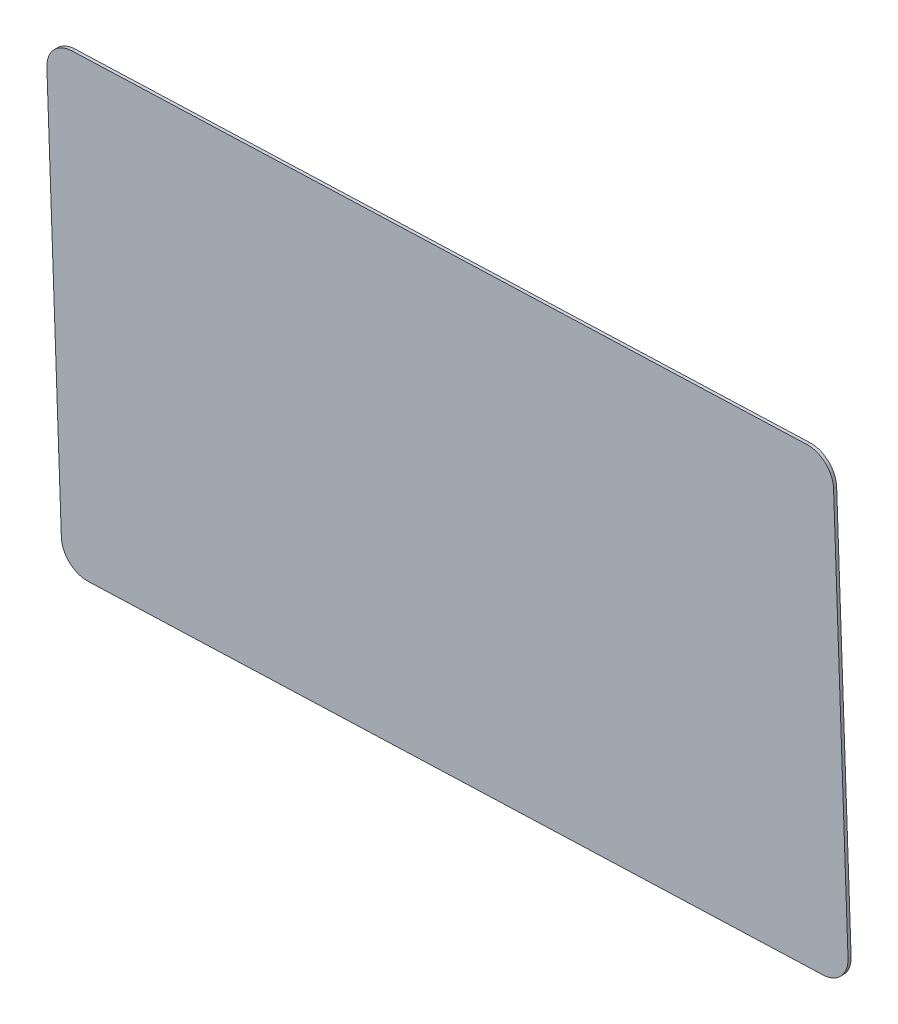
ISO-10303-21;
HEADER;
FILE_DESCRIPTION(('STEP AP214'),'2;1');
FILE_NAME('part.step','',(''),(''),'','','');
FILE_SCHEMA(('AUTOMOTIVE_DESIGN { 1 0 10303 214 1 1 1 1 }'));
ENDSEC;
DATA;
#1=APPLICATION_CONTEXT('core data for automotive mechanical design processes');
#2=APPLICATION_PROTOCOL_DEFINITION('international standard','automotive_design',2000,#1);
#3=PRODUCT_CONTEXT('',#1,'mechanical');
#4=PRODUCT('Part','Part','',(#3));
#5=PRODUCT_RELATED_PRODUCT_CATEGORY('part','',(#4));
#6=PRODUCT_DEFINITION_FORMATION('','',#4);
#7=PRODUCT_DEFINITION_CONTEXT('part definition',#1,'design');
#8=PRODUCT_DEFINITION('design','',#6,#7);
#9=PRODUCT_DEFINITION_SHAPE('','',#8);
#10=(LENGTH_UNIT() NAMED_UNIT(*) SI_UNIT(.MILLI.,.METRE.));
#11=(NAMED_UNIT(*) PLANE_ANGLE_UNIT() SI_UNIT($,.RADIAN.));
#12=(NAMED_UNIT(*) SI_UNIT($,.STERADIAN.) SOLID_ANGLE_UNIT());
#13=UNCERTAINTY_MEASURE_WITH_UNIT(LENGTH_MEASURE(1.E-05),#10,'distance_accuracy_value','');
#14=(GEOMETRIC_REPRESENTATION_CONTEXT(3) GLOBAL_UNCERTAINTY_ASSIGNED_CONTEXT((#13)) GLOBAL_UNIT_ASSIGNED_CONTEXT((#10,
#11,#12)) REPRESENTATION_CONTEXT('',''));
#15=CARTESIAN_POINT('',(0.,0.,0.));
#16=DIRECTION('',(0.,0.,1.));
#17=DIRECTION('',(1.,0.,0.));
#18=AXIS2_PLACEMENT_3D('',#15,#16,#17);
#19=CARTESIAN_POINT('',(141.751264719315,22.2891309095536,-0.762000000000022));
#20=DIRECTION('',(0.,0.,1.));
#21=DIRECTION('',(1.,0.,0.));
#22=AXIS2_PLACEMENT_3D('',#19,#20,#21);
#23=CYLINDRICAL_SURFACE('',#22,6.35);
#24=CARTESIAN_POINT('',(141.751264719315,22.2891309095536,0.));
#25=DIRECTION('',(0.,0.,-1.));
#26=DIRECTION('',(-1.,0.,0.));
#27=AXIS2_PLACEMENT_3D('',#24,#25,#26);
#28=CIRCLE('',#27,6.35);
#29=CARTESIAN_POINT('',(148.097112344466,22.5187347387161,0.));
#30=VERTEX_POINT('',#29);
#31=CARTESIAN_POINT('',(141.980868548478,15.9432832844026,0.));
#32=VERTEX_POINT('',#31);
#33=EDGE_CURVE('E129',#30,#32,#28,.T.);
#34=ORIENTED_EDGE('',*,*,#33,.T.);
#35=DIRECTION('',(0.,0.,1.));
#36=VECTOR('',#35,1.);
#37=CARTESIAN_POINT('',(141.980868548478,15.9432832844026,-0.762000000000023));
#38=LINE('',#37,#36);
#39=CARTESIAN_POINT('',(141.980868548478,15.9432832844026,-0.762000000000023));
#40=VERTEX_POINT('',#39);
#41=EDGE_CURVE('E11',#40,#32,#38,.T.);
#42=ORIENTED_EDGE('',*,*,#41,.F.);
#43=CARTESIAN_POINT('',(141.751264719315,22.2891309095536,-0.762000000000022));
#44=DIRECTION('',(0.,0.,-1.));
#45=DIRECTION('',(-1.,0.,0.));
#46=AXIS2_PLACEMENT_3D('',#43,#44,#45);
#47=CIRCLE('',#46,6.35);
#48=CARTESIAN_POINT('',(148.097112344466,22.5187347387161,-0.762000000000022));
#49=VERTEX_POINT('',#48);
#50=EDGE_CURVE('E143',#49,#40,#47,.T.);
#51=ORIENTED_EDGE('',*,*,#50,.F.);
#52=DIRECTION('',(0.,0.,1.));
#53=VECTOR('',#52,1.);
#54=CARTESIAN_POINT('',(148.097112344466,22.5187347387161,-0.762000000000022));
#55=LINE('',#54,#53);
#56=EDGE_CURVE('E125',#49,#30,#55,.T.);
#57=ORIENTED_EDGE('',*,*,#56,.T.);
#58=EDGE_LOOP('',(#34,#42,#51,#57));
#59=FACE_BOUND('',#58,.T.);
#60=ADVANCED_FACE('F33',(#59),#23,.T.);
#61=CARTESIAN_POINT('',(141.980868548478,15.9432832844026,-0.762000000000023));
#62=DIRECTION('',(-0.036158083332676,0.999346082700936,0.));
#63=DIRECTION('',(-0.999346082700937,-0.036158083332676,0.));
#64=AXIS2_PLACEMENT_3D('',#61,#62,#63);
#65=PLANE('',#64);
#66=DIRECTION('',(-0.999346082700936,-0.036158083332676,0.));
#67=VECTOR('',#66,1.);
#68=CARTESIAN_POINT('',(141.980868548478,15.9432832844026,0.));
#69=LINE('',#68,#67);
#70=CARTESIAN_POINT('',(-38.8757887683241,9.3995741532716,0.));
#71=VERTEX_POINT('',#70);
#72=EDGE_CURVE('E132',#32,#71,#69,.T.);
#73=ORIENTED_EDGE('',*,*,#72,.T.);
#74=DIRECTION('',(0.,0.,1.));
#75=VECTOR('',#74,1.);
#76=CARTESIAN_POINT('',(-38.8757887683241,9.3995741532716,-0.762000000000033));
#77=LINE('',#76,#75);
#78=CARTESIAN_POINT('',(-38.8757887683241,9.3995741532716,-0.762000000000033));
#79=VERTEX_POINT('',#78);
#80=EDGE_CURVE('E41',#79,#71,#77,.T.);
#81=ORIENTED_EDGE('',*,*,#80,.F.);
#82=DIRECTION('',(-0.999346082700936,-0.036158083332676,0.));
#83=VECTOR('',#82,1.);
#84=CARTESIAN_POINT('',(141.980868548478,15.9432832844026,-0.762000000000023));
#85=LINE('',#84,#83);
#86=EDGE_CURVE('E92',#40,#79,#85,.T.);
#87=ORIENTED_EDGE('',*,*,#86,.F.);
#88=ORIENTED_EDGE('',*,*,#41,.T.);
#89=EDGE_LOOP('',(#73,#81,#87,#88));
#90=FACE_BOUND('',#89,.T.);
#91=ADVANCED_FACE('F178',(#90),#65,.F.);
#92=CARTESIAN_POINT('',(-39.1053925974866,15.7454217784225,-0.762000000000033));
#93=DIRECTION('',(0.,0.,1.));
#94=DIRECTION('',(1.,0.,0.));
#95=AXIS2_PLACEMENT_3D('',#92,#93,#94);
#96=CYLINDRICAL_SURFACE('',#95,6.34999999999999);
#97=CARTESIAN_POINT('',(-39.1053925974866,15.7454217784225,0.));
#98=DIRECTION('',(0.,0.,-1.));
#99=DIRECTION('',(-1.,0.,0.));
#100=AXIS2_PLACEMENT_3D('',#97,#98,#99);
#101=CIRCLE('',#100,6.34999999999999);
#102=CARTESIAN_POINT('',(-45.4512402226375,15.51581794926,0.));
#103=VERTEX_POINT('',#102);
#104=EDGE_CURVE('E134',#71,#103,#101,.T.);
#105=ORIENTED_EDGE('',*,*,#104,.T.);
#106=DIRECTION('',(0.,0.,1.));
#107=VECTOR('',#106,1.);
#108=CARTESIAN_POINT('',(-45.4512402226375,15.51581794926,-0.762000000000033));
#109=LINE('',#108,#107);
#110=CARTESIAN_POINT('',(-45.4512402226375,15.51581794926,-0.762000000000033));
#111=VERTEX_POINT('',#110);
#112=EDGE_CURVE('E150',#111,#103,#109,.T.);
#113=ORIENTED_EDGE('',*,*,#112,.F.);
#114=CARTESIAN_POINT('',(-39.1053925974866,15.7454217784225,-0.762000000000033));
#115=DIRECTION('',(0.,0.,-1.));
#116=DIRECTION('',(-1.,0.,0.));
#117=AXIS2_PLACEMENT_3D('',#114,#115,#116);
#118=CIRCLE('',#117,6.34999999999999);
#119=EDGE_CURVE('E158',#79,#111,#118,.T.);
#120=ORIENTED_EDGE('',*,*,#119,.F.);
#121=ORIENTED_EDGE('',*,*,#80,.T.);
#122=EDGE_LOOP('',(#105,#113,#120,#121));
#123=FACE_BOUND('',#122,.T.);
#124=ADVANCED_FACE('F156',(#123),#96,.T.);
#125=CARTESIAN_POINT('',(-49.0100995746561,113.8764561391,-0.762000000000031));
#126=DIRECTION('',(0.999346082700936,0.0361580833326761,0.));
#127=DIRECTION('',(-0.0361580833326761,0.999346082700937,0.));
#128=AXIS2_PLACEMENT_3D('',#125,#126,#127);
#129=PLANE('',#128);
#130=DIRECTION('',(-0.0361580833326761,0.999346082700937,0.));
#131=VECTOR('',#130,1.);
#132=CARTESIAN_POINT('',(-49.0100995746561,113.8764561391,0.));
#133=LINE('',#132,#131);
#134=CARTESIAN_POINT('',(-49.0100995746561,113.8764561391,0.));
#135=VERTEX_POINT('',#134);
#136=EDGE_CURVE('E136',#103,#135,#133,.T.);
#137=ORIENTED_EDGE('',*,*,#136,.T.);
#138=DIRECTION('',(0.,0.,1.));
#139=VECTOR('',#138,1.);
#140=CARTESIAN_POINT('',(-49.0100995746561,113.8764561391,-0.762000000000031));
#141=LINE('',#140,#139);
#142=CARTESIAN_POINT('',(-49.0100995746561,113.8764561391,-0.762000000000031));
#143=VERTEX_POINT('',#142);
#144=EDGE_CURVE('E147',#143,#135,#141,.T.);
#145=ORIENTED_EDGE('',*,*,#144,.F.);
#146=DIRECTION('',(-0.0361580833326761,0.999346082700937,0.));
#147=VECTOR('',#146,1.);
#148=CARTESIAN_POINT('',(-49.0100995746561,113.8764561391,-0.762000000000031));
#149=LINE('',#148,#147);
#150=EDGE_CURVE('E170',#111,#143,#149,.T.);
#151=ORIENTED_EDGE('',*,*,#150,.F.);
#152=ORIENTED_EDGE('',*,*,#112,.T.);
#153=EDGE_LOOP('',(#137,#145,#151,#152));
#154=FACE_BOUND('',#153,.T.);
#155=ADVANCED_FACE('F166',(#154),#129,.F.);
#156=CARTESIAN_POINT('',(-42.6642519495052,114.106059968262,-0.762000000000031));
#157=DIRECTION('',(0.,0.,1.));
#158=DIRECTION('',(1.,0.,0.));
#159=AXIS2_PLACEMENT_3D('',#156,#157,#158);
#160=CYLINDRICAL_SURFACE('',#159,6.34999999999999);
#161=CARTESIAN_POINT('',(-42.6642519495052,114.106059968262,0.));
#162=DIRECTION('',(0.,0.,-1.));
#163=DIRECTION('',(1.,0.,0.));
#164=AXIS2_PLACEMENT_3D('',#161,#162,#163);
#165=CIRCLE('',#164,6.34999999999999);
#166=CARTESIAN_POINT('',(-42.8938557786677,120.451907593413,0.));
#167=VERTEX_POINT('',#166);
#168=EDGE_CURVE('E138',#135,#167,#165,.T.);
#169=ORIENTED_EDGE('',*,*,#168,.T.);
#170=DIRECTION('',(0.,0.,1.));
#171=VECTOR('',#170,1.);
#172=CARTESIAN_POINT('',(-42.8938557786677,120.451907593413,-0.762000000000031));
#173=LINE('',#172,#171);
#174=CARTESIAN_POINT('',(-42.8938557786677,120.451907593413,-0.762000000000031));
#175=VERTEX_POINT('',#174);
#176=EDGE_CURVE('E120',#175,#167,#173,.T.);
#177=ORIENTED_EDGE('',*,*,#176,.F.);
#178=CARTESIAN_POINT('',(-42.6642519495052,114.106059968262,-0.762000000000031));
#179=DIRECTION('',(0.,0.,-1.));
#180=DIRECTION('',(1.,0.,0.));
#181=AXIS2_PLACEMENT_3D('',#178,#179,#180);
#182=CIRCLE('',#181,6.34999999999999);
#183=EDGE_CURVE('E111',#143,#175,#182,.T.);
#184=ORIENTED_EDGE('',*,*,#183,.F.);
#185=ORIENTED_EDGE('',*,*,#144,.T.);
#186=EDGE_LOOP('',(#169,#177,#184,#185));
#187=FACE_BOUND('',#186,.T.);
#188=ADVANCED_FACE('F169',(#187),#160,.T.);
#189=CARTESIAN_POINT('',(137.962801538134,126.995616724544,-0.76200000000002));
#190=DIRECTION('',(0.0361580833326761,-0.999346082700936,0.));
#191=DIRECTION('',(0.999346082700937,0.0361580833326761,0.));
#192=AXIS2_PLACEMENT_3D('',#189,#190,#191);
#193=PLANE('',#192);
#194=DIRECTION('',(0.999346082700936,0.0361580833326761,0.));
#195=VECTOR('',#194,1.);
#196=CARTESIAN_POINT('',(137.962801538134,126.995616724544,0.));
#197=LINE('',#196,#195);
#198=CARTESIAN_POINT('',(137.962801538134,126.995616724544,0.));
#199=VERTEX_POINT('',#198);
#200=EDGE_CURVE('E119',#167,#199,#197,.T.);
#201=ORIENTED_EDGE('',*,*,#200,.T.);
#202=DIRECTION('',(0.,0.,1.));
#203=VECTOR('',#202,1.);
#204=CARTESIAN_POINT('',(137.962801538134,126.995616724544,-0.76200000000002));
#205=LINE('',#204,#203);
#206=CARTESIAN_POINT('',(137.962801538134,126.995616724544,-0.76200000000002));
#207=VERTEX_POINT('',#206);
#208=EDGE_CURVE('E116',#207,#199,#205,.T.);
#209=ORIENTED_EDGE('',*,*,#208,.F.);
#210=DIRECTION('',(0.999346082700936,0.0361580833326761,0.));
#211=VECTOR('',#210,1.);
#212=CARTESIAN_POINT('',(137.962801538134,126.995616724544,-0.76200000000002));
#213=LINE('',#212,#211);
#214=EDGE_CURVE('E105',#175,#207,#213,.T.);
#215=ORIENTED_EDGE('',*,*,#214,.F.);
#216=ORIENTED_EDGE('',*,*,#176,.T.);
#217=EDGE_LOOP('',(#201,#209,#215,#216));
#218=FACE_BOUND('',#217,.T.);
#219=ADVANCED_FACE('F117',(#218),#193,.F.);
#220=CARTESIAN_POINT('',(138.192405367297,120.649769099393,-0.762000000000021));
#221=DIRECTION('',(0.,0.,1.));
#222=DIRECTION('',(1.,0.,0.));
#223=AXIS2_PLACEMENT_3D('',#220,#221,#222);
#224=CYLINDRICAL_SURFACE('',#223,6.35000000000001);
#225=CARTESIAN_POINT('',(138.192405367297,120.649769099393,0.));
#226=DIRECTION('',(0.,0.,-1.));
#227=DIRECTION('',(-1.,0.,0.));
#228=AXIS2_PLACEMENT_3D('',#225,#226,#227);
#229=CIRCLE('',#228,6.35000000000001);
#230=CARTESIAN_POINT('',(144.538252992448,120.879372928556,0.));
#231=VERTEX_POINT('',#230);
#232=EDGE_CURVE('E78',#199,#231,#229,.T.);
#233=ORIENTED_EDGE('',*,*,#232,.T.);
#234=DIRECTION('',(0.,0.,1.));
#235=VECTOR('',#234,1.);
#236=CARTESIAN_POINT('',(144.538252992448,120.879372928556,-0.76200000000002));
#237=LINE('',#236,#235);
#238=CARTESIAN_POINT('',(144.538252992448,120.879372928556,-0.76200000000002));
#239=VERTEX_POINT('',#238);
#240=EDGE_CURVE('E121',#239,#231,#237,.T.);
#241=ORIENTED_EDGE('',*,*,#240,.F.);
#242=CARTESIAN_POINT('',(138.192405367297,120.649769099393,-0.762000000000021));
#243=DIRECTION('',(0.,0.,-1.));
#244=DIRECTION('',(-1.,0.,0.));
#245=AXIS2_PLACEMENT_3D('',#242,#243,#244);
#246=CIRCLE('',#245,6.35000000000001);
#247=EDGE_CURVE('E109',#207,#239,#246,.T.);
#248=ORIENTED_EDGE('',*,*,#247,.F.);
#249=ORIENTED_EDGE('',*,*,#208,.T.);
#250=EDGE_LOOP('',(#233,#241,#248,#249));
#251=FACE_BOUND('',#250,.T.);
#252=ADVANCED_FACE('F123',(#251),#224,.T.);
#253=CARTESIAN_POINT('',(144.538252992448,120.879372928556,-0.76200000000002));
#254=DIRECTION('',(-0.999346082700936,-0.0361580833326762,0.));
#255=DIRECTION('',(0.0361580833326763,-0.999346082700937,0.));
#256=AXIS2_PLACEMENT_3D('',#253,#254,#255);
#257=PLANE('',#256);
#258=DIRECTION('',(0.0361580833326762,-0.999346082700937,0.));
#259=VECTOR('',#258,1.);
#260=CARTESIAN_POINT('',(144.538252992448,120.879372928556,0.));
#261=LINE('',#260,#259);
#262=EDGE_CURVE('E84',#231,#30,#261,.T.);
#263=ORIENTED_EDGE('',*,*,#262,.T.);
#264=ORIENTED_EDGE('',*,*,#56,.F.);
#265=DIRECTION('',(0.0361580833326762,-0.999346082700937,0.));
#266=VECTOR('',#265,1.);
#267=CARTESIAN_POINT('',(144.538252992448,120.879372928556,-0.76200000000002));
#268=LINE('',#267,#266);
#269=EDGE_CURVE('E49',#239,#49,#268,.T.);
#270=ORIENTED_EDGE('',*,*,#269,.F.);
#271=ORIENTED_EDGE('',*,*,#240,.T.);
#272=EDGE_LOOP('',(#263,#264,#270,#271));
#273=FACE_BOUND('',#272,.T.);
#274=ADVANCED_FACE('F194',(#273),#257,.F.);
#275=CARTESIAN_POINT('',(141.751264719315,22.2891309095536,-0.762000000000022));
#276=DIRECTION('',(0.,0.,-1.));
#277=DIRECTION('',(-1.,0.,0.));
#278=AXIS2_PLACEMENT_3D('',#275,#276,#277);
#279=PLANE('',#278);
#280=ORIENTED_EDGE('',*,*,#50,.T.);
#281=ORIENTED_EDGE('',*,*,#86,.T.);
#282=ORIENTED_EDGE('',*,*,#119,.T.);
#283=ORIENTED_EDGE('',*,*,#150,.T.);
#284=ORIENTED_EDGE('',*,*,#183,.T.);
#285=ORIENTED_EDGE('',*,*,#214,.T.);
#286=ORIENTED_EDGE('',*,*,#247,.T.);
#287=ORIENTED_EDGE('',*,*,#269,.T.);
#288=EDGE_LOOP('',(#280,#281,#282,#283,#284,#285,#286,#287));
#289=FACE_BOUND('',#288,.T.);
#290=ADVANCED_FACE('F107',(#289),#279,.T.);
#291=CARTESIAN_POINT('',(141.751264719315,22.2891309095536,0.));
#292=DIRECTION('',(0.,0.,-1.));
#293=DIRECTION('',(-1.,0.,0.));
#294=AXIS2_PLACEMENT_3D('',#291,#292,#293);
#295=PLANE('',#294);
#296=ORIENTED_EDGE('',*,*,#33,.F.);
#297=ORIENTED_EDGE('',*,*,#262,.F.);
#298=ORIENTED_EDGE('',*,*,#232,.F.);
#299=ORIENTED_EDGE('',*,*,#200,.F.);
#300=ORIENTED_EDGE('',*,*,#168,.F.);
#301=ORIENTED_EDGE('',*,*,#136,.F.);
#302=ORIENTED_EDGE('',*,*,#104,.F.);
#303=ORIENTED_EDGE('',*,*,#72,.F.);
#304=EDGE_LOOP('',(#296,#297,#298,#299,#300,#301,#302,#303));
#305=FACE_BOUND('',#304,.T.);
#306=ADVANCED_FACE('F162',(#305),#295,.F.);
#307=CLOSED_SHELL('',(#60,#91,#124,#155,#188,#219,#252,#274,#290,#306));
#308=MANIFOLD_SOLID_BREP('B2',#307);
#309=ADVANCED_BREP_SHAPE_REPRESENTATION('',(#18,#308),#14);
#310=SHAPE_DEFINITION_REPRESENTATION(#9,#309);
ENDSEC;
END-ISO-10303-21;
